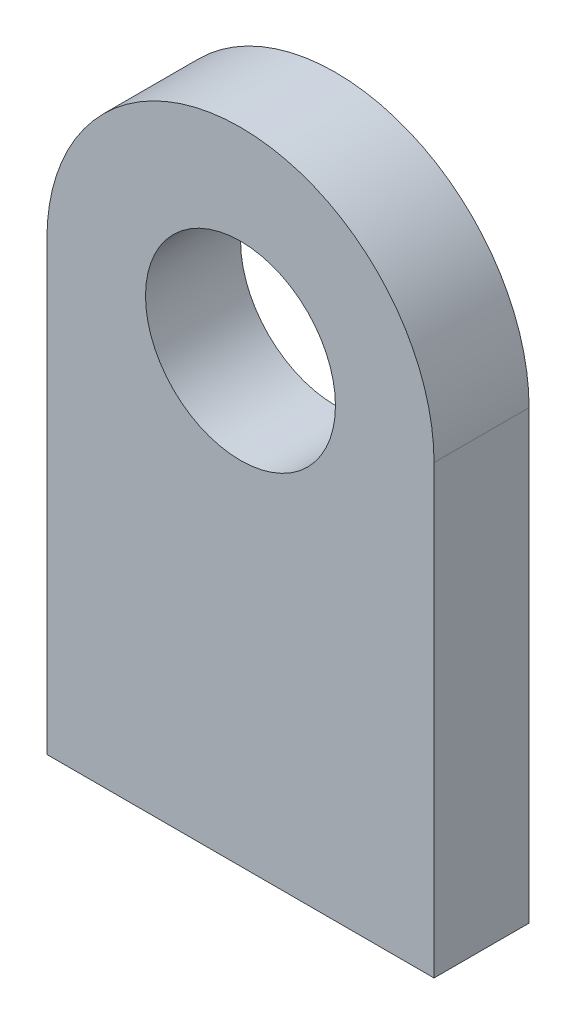
ISO-10303-21;
HEADER;
FILE_DESCRIPTION(('STEP AP214'),'2;1');
FILE_NAME('part.step','',(''),(''),'','','');
FILE_SCHEMA(('AUTOMOTIVE_DESIGN { 1 0 10303 214 1 1 1 1 }'));
ENDSEC;
DATA;
#1=APPLICATION_CONTEXT('core data for automotive mechanical design processes');
#2=APPLICATION_PROTOCOL_DEFINITION('international standard','automotive_design',2000,#1);
#3=PRODUCT_CONTEXT('',#1,'mechanical');
#4=PRODUCT('Part','Part','',(#3));
#5=PRODUCT_RELATED_PRODUCT_CATEGORY('part','',(#4));
#6=PRODUCT_DEFINITION_FORMATION('','',#4);
#7=PRODUCT_DEFINITION_CONTEXT('part definition',#1,'design');
#8=PRODUCT_DEFINITION('design','',#6,#7);
#9=PRODUCT_DEFINITION_SHAPE('','',#8);
#10=(LENGTH_UNIT() NAMED_UNIT(*) SI_UNIT(.MILLI.,.METRE.));
#11=(NAMED_UNIT(*) PLANE_ANGLE_UNIT() SI_UNIT($,.RADIAN.));
#12=(NAMED_UNIT(*) SI_UNIT($,.STERADIAN.) SOLID_ANGLE_UNIT());
#13=UNCERTAINTY_MEASURE_WITH_UNIT(LENGTH_MEASURE(1.E-05),#10,'distance_accuracy_value','');
#14=(GEOMETRIC_REPRESENTATION_CONTEXT(3) GLOBAL_UNCERTAINTY_ASSIGNED_CONTEXT((#13)) GLOBAL_UNIT_ASSIGNED_CONTEXT((#10,
#11,#12)) REPRESENTATION_CONTEXT('',''));
#15=CARTESIAN_POINT('',(0.,0.,0.));
#16=DIRECTION('',(0.,0.,1.));
#17=DIRECTION('',(1.,0.,0.));
#18=AXIS2_PLACEMENT_3D('',#15,#16,#17);
#19=CARTESIAN_POINT('',(12.28,28.32,6.03));
#20=DIRECTION('',(0.,0.,1.));
#21=DIRECTION('',(1.,0.,0.));
#22=AXIS2_PLACEMENT_3D('',#19,#20,#21);
#23=PLANE('',#22);
#24=DIRECTION('',(0.,-1.,0.));
#25=VECTOR('',#24,1.);
#26=CARTESIAN_POINT('',(0.,28.32,6.03));
#27=LINE('',#26,#25);
#28=CARTESIAN_POINT('',(0.,28.32,6.03));
#29=VERTEX_POINT('',#28);
#30=CARTESIAN_POINT('',(0.,0.,6.03));
#31=VERTEX_POINT('',#30);
#32=EDGE_CURVE('E97',#29,#31,#27,.T.);
#33=ORIENTED_EDGE('',*,*,#32,.T.);
#34=DIRECTION('',(1.,0.,0.));
#35=VECTOR('',#34,1.);
#36=CARTESIAN_POINT('',(0.,0.,6.03));
#37=LINE('',#36,#35);
#38=CARTESIAN_POINT('',(24.56,0.,6.03));
#39=VERTEX_POINT('',#38);
#40=EDGE_CURVE('E92',#31,#39,#37,.T.);
#41=ORIENTED_EDGE('',*,*,#40,.T.);
#42=DIRECTION('',(0.,1.,0.));
#43=VECTOR('',#42,1.);
#44=CARTESIAN_POINT('',(24.56,0.,6.03));
#45=LINE('',#44,#43);
#46=CARTESIAN_POINT('',(24.56,28.32,6.03));
#47=VERTEX_POINT('',#46);
#48=EDGE_CURVE('E95',#39,#47,#45,.T.);
#49=ORIENTED_EDGE('',*,*,#48,.T.);
#50=CARTESIAN_POINT('',(12.28,28.32,6.03));
#51=DIRECTION('',(0.,0.,1.));
#52=DIRECTION('',(1.,0.,0.));
#53=AXIS2_PLACEMENT_3D('',#50,#51,#52);
#54=CIRCLE('',#53,12.28);
#55=EDGE_CURVE('E62',#47,#29,#54,.T.);
#56=ORIENTED_EDGE('',*,*,#55,.T.);
#57=EDGE_LOOP('',(#33,#41,#49,#56));
#58=FACE_BOUND('',#57,.T.);
#59=CARTESIAN_POINT('',(12.28,28.32,6.03));
#60=DIRECTION('',(0.,0.,1.));
#61=DIRECTION('',(1.,0.,0.));
#62=AXIS2_PLACEMENT_3D('',#59,#60,#61);
#63=CIRCLE('',#62,6.025);
#64=CARTESIAN_POINT('',(18.305,28.32,6.03));
#65=VERTEX_POINT('',#64);
#66=EDGE_CURVE('E112',#65,#65,#63,.T.);
#67=ORIENTED_EDGE('',*,*,#66,.F.);
#68=EDGE_LOOP('',(#67));
#69=FACE_BOUND('',#68,.T.);
#70=ADVANCED_FACE('F45',(#58,#69),#23,.T.);
#71=CARTESIAN_POINT('',(12.28,28.32,0.));
#72=DIRECTION('',(0.,0.,1.));
#73=DIRECTION('',(1.,0.,0.));
#74=AXIS2_PLACEMENT_3D('',#71,#72,#73);
#75=PLANE('',#74);
#76=DIRECTION('',(0.,-1.,0.));
#77=VECTOR('',#76,1.);
#78=CARTESIAN_POINT('',(0.,28.32,0.));
#79=LINE('',#78,#77);
#80=CARTESIAN_POINT('',(0.,28.32,0.));
#81=VERTEX_POINT('',#80);
#82=CARTESIAN_POINT('',(0.,0.,0.));
#83=VERTEX_POINT('',#82);
#84=EDGE_CURVE('E109',#81,#83,#79,.T.);
#85=ORIENTED_EDGE('',*,*,#84,.F.);
#86=CARTESIAN_POINT('',(12.28,28.32,0.));
#87=DIRECTION('',(0.,0.,1.));
#88=DIRECTION('',(1.,0.,0.));
#89=AXIS2_PLACEMENT_3D('',#86,#87,#88);
#90=CIRCLE('',#89,12.28);
#91=CARTESIAN_POINT('',(24.56,28.32,0.));
#92=VERTEX_POINT('',#91);
#93=EDGE_CURVE('E85',#92,#81,#90,.T.);
#94=ORIENTED_EDGE('',*,*,#93,.F.);
#95=DIRECTION('',(0.,1.,0.));
#96=VECTOR('',#95,1.);
#97=CARTESIAN_POINT('',(24.56,0.,0.));
#98=LINE('',#97,#96);
#99=CARTESIAN_POINT('',(24.56,0.,0.));
#100=VERTEX_POINT('',#99);
#101=EDGE_CURVE('E79',#100,#92,#98,.T.);
#102=ORIENTED_EDGE('',*,*,#101,.F.);
#103=DIRECTION('',(1.,0.,0.));
#104=VECTOR('',#103,1.);
#105=CARTESIAN_POINT('',(0.,0.,0.));
#106=LINE('',#105,#104);
#107=EDGE_CURVE('E101',#83,#100,#106,.T.);
#108=ORIENTED_EDGE('',*,*,#107,.F.);
#109=EDGE_LOOP('',(#85,#94,#102,#108));
#110=FACE_BOUND('',#109,.T.);
#111=CARTESIAN_POINT('',(12.28,28.32,0.));
#112=DIRECTION('',(0.,0.,1.));
#113=DIRECTION('',(1.,0.,0.));
#114=AXIS2_PLACEMENT_3D('',#111,#112,#113);
#115=CIRCLE('',#114,6.025);
#116=CARTESIAN_POINT('',(18.305,28.32,0.));
#117=VERTEX_POINT('',#116);
#118=EDGE_CURVE('E124',#117,#117,#115,.T.);
#119=ORIENTED_EDGE('',*,*,#118,.T.);
#120=EDGE_LOOP('',(#119));
#121=FACE_BOUND('',#120,.T.);
#122=ADVANCED_FACE('F120',(#110,#121),#75,.F.);
#123=CARTESIAN_POINT('',(0.,28.32,6.03));
#124=DIRECTION('',(1.,0.,0.));
#125=DIRECTION('',(0.,0.,-1.));
#126=AXIS2_PLACEMENT_3D('',#123,#124,#125);
#127=PLANE('',#126);
#128=ORIENTED_EDGE('',*,*,#84,.T.);
#129=DIRECTION('',(0.,0.,-1.));
#130=VECTOR('',#129,1.);
#131=CARTESIAN_POINT('',(0.,0.,6.03));
#132=LINE('',#131,#130);
#133=EDGE_CURVE('E11',#31,#83,#132,.T.);
#134=ORIENTED_EDGE('',*,*,#133,.F.);
#135=ORIENTED_EDGE('',*,*,#32,.F.);
#136=DIRECTION('',(0.,0.,-1.));
#137=VECTOR('',#136,1.);
#138=CARTESIAN_POINT('',(0.,28.32,6.03));
#139=LINE('',#138,#137);
#140=EDGE_CURVE('E105',#29,#81,#139,.T.);
#141=ORIENTED_EDGE('',*,*,#140,.T.);
#142=EDGE_LOOP('',(#128,#134,#135,#141));
#143=FACE_BOUND('',#142,.T.);
#144=ADVANCED_FACE('F47',(#143),#127,.F.);
#145=CARTESIAN_POINT('',(0.,0.,6.03));
#146=DIRECTION('',(0.,1.,0.));
#147=DIRECTION('',(0.,0.,1.));
#148=AXIS2_PLACEMENT_3D('',#145,#146,#147);
#149=PLANE('',#148);
#150=CARTESIAN_POINT('',(5.28,0.,3.01499999999999));
#151=DIRECTION('',(0.,-1.,0.));
#152=DIRECTION('',(0.,0.,-1.));
#153=AXIS2_PLACEMENT_3D('',#150,#151,#152);
#154=CIRCLE('',#153,2.25);
#155=CARTESIAN_POINT('',(5.28,0.,0.764999999999996));
#156=VERTEX_POINT('',#155);
#157=EDGE_CURVE('E136',#156,#156,#154,.T.);
#158=ORIENTED_EDGE('',*,*,#157,.F.);
#159=EDGE_LOOP('',(#158));
#160=FACE_BOUND('',#159,.T.);
#161=CARTESIAN_POINT('',(19.28,0.,3.015));
#162=DIRECTION('',(0.,-1.,0.));
#163=DIRECTION('',(0.,0.,-1.));
#164=AXIS2_PLACEMENT_3D('',#161,#162,#163);
#165=CIRCLE('',#164,2.25);
#166=CARTESIAN_POINT('',(19.28,0.,0.765000000000001));
#167=VERTEX_POINT('',#166);
#168=EDGE_CURVE('E130',#167,#167,#165,.T.);
#169=ORIENTED_EDGE('',*,*,#168,.F.);
#170=EDGE_LOOP('',(#169));
#171=FACE_BOUND('',#170,.T.);
#172=ORIENTED_EDGE('',*,*,#107,.T.);
#173=DIRECTION('',(0.,0.,-1.));
#174=VECTOR('',#173,1.);
#175=CARTESIAN_POINT('',(24.56,0.,6.03));
#176=LINE('',#175,#174);
#177=EDGE_CURVE('E54',#39,#100,#176,.T.);
#178=ORIENTED_EDGE('',*,*,#177,.F.);
#179=ORIENTED_EDGE('',*,*,#40,.F.);
#180=ORIENTED_EDGE('',*,*,#133,.T.);
#181=EDGE_LOOP('',(#172,#178,#179,#180));
#182=FACE_BOUND('',#181,.T.);
#183=ADVANCED_FACE('F100',(#160,#171,#182),#149,.F.);
#184=CARTESIAN_POINT('',(24.56,0.,6.03));
#185=DIRECTION('',(-1.,0.,0.));
#186=DIRECTION('',(0.,0.,1.));
#187=AXIS2_PLACEMENT_3D('',#184,#185,#186);
#188=PLANE('',#187);
#189=ORIENTED_EDGE('',*,*,#101,.T.);
#190=DIRECTION('',(0.,0.,-1.));
#191=VECTOR('',#190,1.);
#192=CARTESIAN_POINT('',(24.56,28.32,6.03));
#193=LINE('',#192,#191);
#194=EDGE_CURVE('E102',#47,#92,#193,.T.);
#195=ORIENTED_EDGE('',*,*,#194,.F.);
#196=ORIENTED_EDGE('',*,*,#48,.F.);
#197=ORIENTED_EDGE('',*,*,#177,.T.);
#198=EDGE_LOOP('',(#189,#195,#196,#197));
#199=FACE_BOUND('',#198,.T.);
#200=ADVANCED_FACE('F103',(#199),#188,.F.);
#201=CARTESIAN_POINT('',(12.28,28.32,6.03));
#202=DIRECTION('',(0.,0.,-1.));
#203=DIRECTION('',(-1.,0.,0.));
#204=AXIS2_PLACEMENT_3D('',#201,#202,#203);
#205=CYLINDRICAL_SURFACE('',#204,12.28);
#206=ORIENTED_EDGE('',*,*,#93,.T.);
#207=ORIENTED_EDGE('',*,*,#140,.F.);
#208=ORIENTED_EDGE('',*,*,#55,.F.);
#209=ORIENTED_EDGE('',*,*,#194,.T.);
#210=EDGE_LOOP('',(#206,#207,#208,#209));
#211=FACE_BOUND('',#210,.T.);
#212=ADVANCED_FACE('F117',(#211),#205,.T.);
#213=CARTESIAN_POINT('',(12.28,28.32,6.03));
#214=DIRECTION('',(0.,0.,-1.));
#215=DIRECTION('',(-1.,0.,0.));
#216=AXIS2_PLACEMENT_3D('',#213,#214,#215);
#217=CYLINDRICAL_SURFACE('',#216,6.025);
#218=ORIENTED_EDGE('',*,*,#66,.T.);
#219=EDGE_LOOP('',(#218));
#220=FACE_BOUND('',#219,.T.);
#221=ORIENTED_EDGE('',*,*,#118,.F.);
#222=EDGE_LOOP('',(#221));
#223=FACE_BOUND('',#222,.T.);
#224=ADVANCED_FACE('F157',(#220,#223),#217,.F.);
#225=CARTESIAN_POINT('',(19.28,6.03,3.015));
#226=DIRECTION('',(0.,-1.,0.));
#227=DIRECTION('',(0.,0.,-1.));
#228=AXIS2_PLACEMENT_3D('',#225,#226,#227);
#229=CYLINDRICAL_SURFACE('',#228,2.25);
#230=CARTESIAN_POINT('',(19.28,6.03,3.015));
#231=DIRECTION('',(0.,-1.,0.));
#232=DIRECTION('',(0.,0.,-1.));
#233=AXIS2_PLACEMENT_3D('',#230,#231,#232);
#234=CIRCLE('',#233,2.25);
#235=CARTESIAN_POINT('',(19.28,6.03,0.765000000000001));
#236=VERTEX_POINT('',#235);
#237=EDGE_CURVE('E133',#236,#236,#234,.T.);
#238=ORIENTED_EDGE('',*,*,#237,.F.);
#239=EDGE_LOOP('',(#238));
#240=FACE_BOUND('',#239,.T.);
#241=ORIENTED_EDGE('',*,*,#168,.T.);
#242=EDGE_LOOP('',(#241));
#243=FACE_BOUND('',#242,.T.);
#244=ADVANCED_FACE('F155',(#240,#243),#229,.F.);
#245=CARTESIAN_POINT('',(19.28,6.03,3.015));
#246=DIRECTION('',(0.,-1.,0.));
#247=DIRECTION('',(0.,0.,-1.));
#248=AXIS2_PLACEMENT_3D('',#245,#246,#247);
#249=PLANE('',#248);
#250=ORIENTED_EDGE('',*,*,#237,.T.);
#251=EDGE_LOOP('',(#250));
#252=FACE_BOUND('',#251,.T.);
#253=ADVANCED_FACE('F147',(#252),#249,.T.);
#254=CARTESIAN_POINT('',(5.28,6.03,3.01499999999999));
#255=DIRECTION('',(0.,-1.,0.));
#256=DIRECTION('',(0.,0.,-1.));
#257=AXIS2_PLACEMENT_3D('',#254,#255,#256);
#258=CYLINDRICAL_SURFACE('',#257,2.25);
#259=CARTESIAN_POINT('',(5.28,6.03,3.01499999999999));
#260=DIRECTION('',(0.,-1.,0.));
#261=DIRECTION('',(0.,0.,-1.));
#262=AXIS2_PLACEMENT_3D('',#259,#260,#261);
#263=CIRCLE('',#262,2.25);
#264=CARTESIAN_POINT('',(5.28,6.03,0.764999999999996));
#265=VERTEX_POINT('',#264);
#266=EDGE_CURVE('E127',#265,#265,#263,.T.);
#267=ORIENTED_EDGE('',*,*,#266,.F.);
#268=EDGE_LOOP('',(#267));
#269=FACE_BOUND('',#268,.T.);
#270=ORIENTED_EDGE('',*,*,#157,.T.);
#271=EDGE_LOOP('',(#270));
#272=FACE_BOUND('',#271,.T.);
#273=ADVANCED_FACE('F144',(#269,#272),#258,.F.);
#274=CARTESIAN_POINT('',(5.28,6.03,3.01499999999999));
#275=DIRECTION('',(0.,-1.,0.));
#276=DIRECTION('',(0.,0.,-1.));
#277=AXIS2_PLACEMENT_3D('',#274,#275,#276);
#278=PLANE('',#277);
#279=ORIENTED_EDGE('',*,*,#266,.T.);
#280=EDGE_LOOP('',(#279));
#281=FACE_BOUND('',#280,.T.);
#282=ADVANCED_FACE('F142',(#281),#278,.T.);
#283=CLOSED_SHELL('',(#70,#122,#144,#183,#200,#212,#224,#244,#253,#273,#282));
#284=MANIFOLD_SOLID_BREP('B2',#283);
#285=ADVANCED_BREP_SHAPE_REPRESENTATION('',(#18,#284),#14);
#286=SHAPE_DEFINITION_REPRESENTATION(#9,#285);
ENDSEC;
END-ISO-10303-21;
